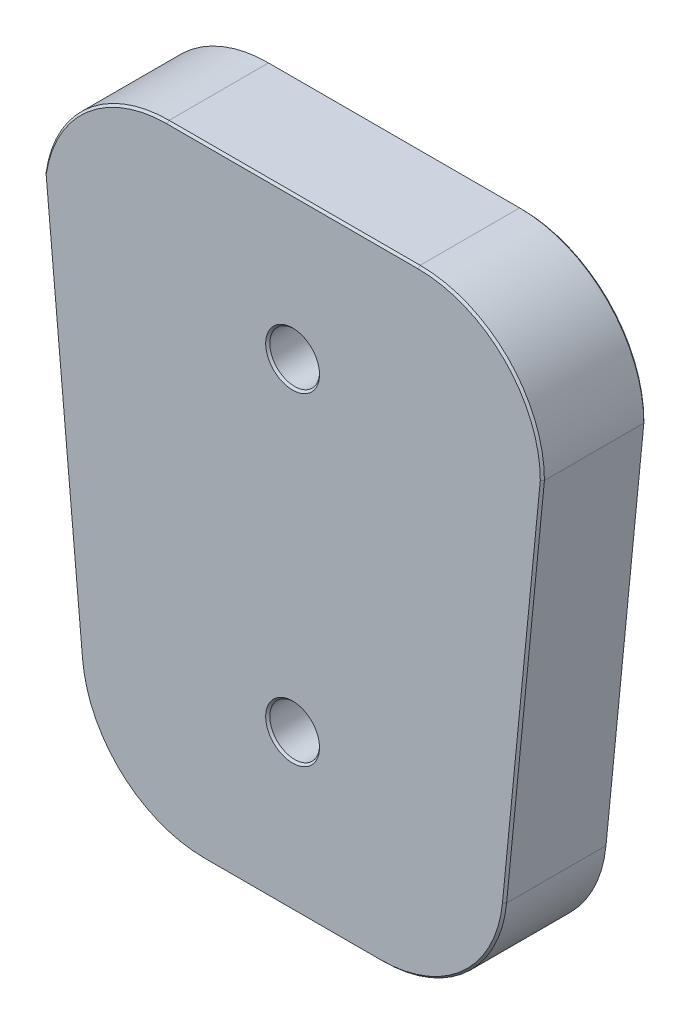
ISO-10303-21;
HEADER;
FILE_DESCRIPTION(('STEP AP214'),'2;1');
FILE_NAME('part.step','',(''),(''),'','','');
FILE_SCHEMA(('AUTOMOTIVE_DESIGN { 1 0 10303 214 1 1 1 1 }'));
ENDSEC;
DATA;
#1=APPLICATION_CONTEXT('core data for automotive mechanical design processes');
#2=APPLICATION_PROTOCOL_DEFINITION('international standard','automotive_design',2000,#1);
#3=PRODUCT_CONTEXT('',#1,'mechanical');
#4=PRODUCT('Part','Part','',(#3));
#5=PRODUCT_RELATED_PRODUCT_CATEGORY('part','',(#4));
#6=PRODUCT_DEFINITION_FORMATION('','',#4);
#7=PRODUCT_DEFINITION_CONTEXT('part definition',#1,'design');
#8=PRODUCT_DEFINITION('design','',#6,#7);
#9=PRODUCT_DEFINITION_SHAPE('','',#8);
#10=(LENGTH_UNIT() NAMED_UNIT(*) SI_UNIT(.MILLI.,.METRE.));
#11=(NAMED_UNIT(*) PLANE_ANGLE_UNIT() SI_UNIT($,.RADIAN.));
#12=(NAMED_UNIT(*) SI_UNIT($,.STERADIAN.) SOLID_ANGLE_UNIT());
#13=UNCERTAINTY_MEASURE_WITH_UNIT(LENGTH_MEASURE(1.E-05),#10,'distance_accuracy_value','');
#14=(GEOMETRIC_REPRESENTATION_CONTEXT(3) GLOBAL_UNCERTAINTY_ASSIGNED_CONTEXT((#13)) GLOBAL_UNIT_ASSIGNED_CONTEXT((#10,
#11,#12)) REPRESENTATION_CONTEXT('',''));
#15=CARTESIAN_POINT('',(0.,0.,0.));
#16=DIRECTION('',(0.,0.,1.));
#17=DIRECTION('',(1.,0.,0.));
#18=AXIS2_PLACEMENT_3D('',#15,#16,#17);
#19=CARTESIAN_POINT('',(0.,-25.6955708188177,25.));
#20=DIRECTION('',(0.995905243780852,0.0904032378280924,0.));
#21=DIRECTION('',(-0.0904032378280924,0.995905243780852,0.));
#22=AXIS2_PLACEMENT_3D('',#19,#20,#21);
#23=PLANE('',#22);
#24=DIRECTION('',(0.,0.,-1.));
#25=VECTOR('',#24,1.);
#26=CARTESIAN_POINT('',(0.,-25.6955708188177,25.));
#27=LINE('',#26,#25);
#28=CARTESIAN_POINT('',(0.,-25.6955708188177,24.5));
#29=VERTEX_POINT('',#28);
#30=CARTESIAN_POINT('',(0.,-25.6955708188177,0.5));
#31=VERTEX_POINT('',#30);
#32=EDGE_CURVE('E423',#29,#31,#27,.T.);
#33=ORIENTED_EDGE('',*,*,#32,.T.);
#34=DIRECTION('',(0.0904032378280924,-0.995905243780852,0.));
#35=VECTOR('',#34,1.);
#36=CARTESIAN_POINT('',(0.,-25.6955708188177,0.5));
#37=LINE('',#36,#35);
#38=CARTESIAN_POINT('',(8.80666926554806,-122.712097134843,0.5));
#39=VERTEX_POINT('',#38);
#40=EDGE_CURVE('E246',#31,#39,#37,.T.);
#41=ORIENTED_EDGE('',*,*,#40,.T.);
#42=DIRECTION('',(0.,0.,-1.));
#43=VECTOR('',#42,1.);
#44=CARTESIAN_POINT('',(8.80666926554806,-122.712097134843,25.));
#45=LINE('',#44,#43);
#46=CARTESIAN_POINT('',(8.80666926554806,-122.712097134843,24.5));
#47=VERTEX_POINT('',#46);
#48=EDGE_CURVE('E179',#47,#39,#45,.T.);
#49=ORIENTED_EDGE('',*,*,#48,.F.);
#50=DIRECTION('',(-0.0904032378280924,0.995905243780852,0.));
#51=VECTOR('',#50,1.);
#52=CARTESIAN_POINT('',(0.,-25.6955708188177,24.5));
#53=LINE('',#52,#51);
#54=EDGE_CURVE('E244',#47,#29,#53,.T.);
#55=ORIENTED_EDGE('',*,*,#54,.T.);
#56=EDGE_LOOP('',(#33,#41,#49,#55));
#57=FACE_BOUND('',#56,.T.);
#58=ADVANCED_FACE('F40',(#57),#23,.F.);
#59=CARTESIAN_POINT('',(38.6838265789736,-120.,25.));
#60=DIRECTION('',(0.,0.,-1.));
#61=DIRECTION('',(-1.,0.,0.));
#62=AXIS2_PLACEMENT_3D('',#59,#60,#61);
#63=CYLINDRICAL_SURFACE('',#62,30.);
#64=ORIENTED_EDGE('',*,*,#48,.T.);
#65=CARTESIAN_POINT('',(38.6838265789736,-120.,0.5));
#66=DIRECTION('',(0.,0.,1.));
#67=DIRECTION('',(1.,0.,0.));
#68=AXIS2_PLACEMENT_3D('',#65,#66,#67);
#69=CIRCLE('',#68,30.);
#70=CARTESIAN_POINT('',(38.6838265789738,-150.,0.5));
#71=VERTEX_POINT('',#70);
#72=EDGE_CURVE('E178',#39,#71,#69,.T.);
#73=ORIENTED_EDGE('',*,*,#72,.T.);
#74=DIRECTION('',(0.,0.,-1.));
#75=VECTOR('',#74,1.);
#76=CARTESIAN_POINT('',(38.6838265789738,-150.,25.));
#77=LINE('',#76,#75);
#78=CARTESIAN_POINT('',(38.6838265789738,-150.,24.5));
#79=VERTEX_POINT('',#78);
#80=EDGE_CURVE('E160',#79,#71,#77,.T.);
#81=ORIENTED_EDGE('',*,*,#80,.F.);
#82=CARTESIAN_POINT('',(38.6838265789736,-120.,24.5));
#83=DIRECTION('',(0.,0.,1.));
#84=DIRECTION('',(1.,0.,0.));
#85=AXIS2_PLACEMENT_3D('',#82,#83,#84);
#86=CIRCLE('',#85,30.);
#87=EDGE_CURVE('E175',#79,#47,#86,.F.);
#88=ORIENTED_EDGE('',*,*,#87,.T.);
#89=EDGE_LOOP('',(#64,#73,#81,#88));
#90=FACE_BOUND('',#89,.T.);
#91=ADVANCED_FACE('F173',(#90),#63,.T.);
#92=CARTESIAN_POINT('',(38.6838265789738,-150.,25.));
#93=DIRECTION('',(0.,1.,0.));
#94=DIRECTION('',(0.,0.,1.));
#95=AXIS2_PLACEMENT_3D('',#92,#93,#94);
#96=PLANE('',#95);
#97=ORIENTED_EDGE('',*,*,#80,.T.);
#98=DIRECTION('',(1.,0.,0.));
#99=VECTOR('',#98,1.);
#100=CARTESIAN_POINT('',(38.6838265789738,-150.,0.5));
#101=LINE('',#100,#99);
#102=CARTESIAN_POINT('',(81.3161734210264,-150.,0.5));
#103=VERTEX_POINT('',#102);
#104=EDGE_CURVE('E167',#71,#103,#101,.T.);
#105=ORIENTED_EDGE('',*,*,#104,.T.);
#106=DIRECTION('',(0.,0.,-1.));
#107=VECTOR('',#106,1.);
#108=CARTESIAN_POINT('',(81.3161734210264,-150.,25.));
#109=LINE('',#108,#107);
#110=CARTESIAN_POINT('',(81.3161734210264,-150.,24.5));
#111=VERTEX_POINT('',#110);
#112=EDGE_CURVE('E162',#111,#103,#109,.T.);
#113=ORIENTED_EDGE('',*,*,#112,.F.);
#114=DIRECTION('',(-1.,0.,0.));
#115=VECTOR('',#114,1.);
#116=CARTESIAN_POINT('',(38.6838265789738,-150.,24.5));
#117=LINE('',#116,#115);
#118=EDGE_CURVE('E157',#111,#79,#117,.T.);
#119=ORIENTED_EDGE('',*,*,#118,.T.);
#120=EDGE_LOOP('',(#97,#105,#113,#119));
#121=FACE_BOUND('',#120,.T.);
#122=ADVANCED_FACE('F159',(#121),#96,.F.);
#123=CARTESIAN_POINT('',(81.3161734210264,-120.,25.));
#124=DIRECTION('',(0.,0.,-1.));
#125=DIRECTION('',(-1.,0.,0.));
#126=AXIS2_PLACEMENT_3D('',#123,#124,#125);
#127=CYLINDRICAL_SURFACE('',#126,30.);
#128=ORIENTED_EDGE('',*,*,#112,.T.);
#129=CARTESIAN_POINT('',(81.3161734210264,-120.,0.5));
#130=DIRECTION('',(0.,0.,1.));
#131=DIRECTION('',(1.,0.,0.));
#132=AXIS2_PLACEMENT_3D('',#129,#130,#131);
#133=CIRCLE('',#132,30.);
#134=CARTESIAN_POINT('',(111.172189546731,-122.935694313387,0.5));
#135=VERTEX_POINT('',#134);
#136=EDGE_CURVE('E225',#103,#135,#133,.T.);
#137=ORIENTED_EDGE('',*,*,#136,.T.);
#138=DIRECTION('',(0.,0.,-1.));
#139=VECTOR('',#138,1.);
#140=CARTESIAN_POINT('',(111.172189546731,-122.935694313387,25.));
#141=LINE('',#140,#139);
#142=CARTESIAN_POINT('',(111.172189546731,-122.935694313387,24.5));
#143=VERTEX_POINT('',#142);
#144=EDGE_CURVE('E408',#143,#135,#141,.T.);
#145=ORIENTED_EDGE('',*,*,#144,.F.);
#146=CARTESIAN_POINT('',(81.3161734210264,-120.,24.5));
#147=DIRECTION('',(0.,0.,1.));
#148=DIRECTION('',(1.,0.,0.));
#149=AXIS2_PLACEMENT_3D('',#146,#147,#148);
#150=CIRCLE('',#149,30.);
#151=EDGE_CURVE('E223',#143,#111,#150,.F.);
#152=ORIENTED_EDGE('',*,*,#151,.T.);
#153=EDGE_LOOP('',(#128,#137,#145,#152));
#154=FACE_BOUND('',#153,.T.);
#155=ADVANCED_FACE('F405',(#154),#127,.T.);
#156=CARTESIAN_POINT('',(111.172189546731,-122.935694313387,25.));
#157=DIRECTION('',(-0.995200537523495,0.0978564771128945,0.));
#158=DIRECTION('',(-0.0978564771128945,-0.995200537523495,0.));
#159=AXIS2_PLACEMENT_3D('',#156,#157,#158);
#160=PLANE('',#159);
#161=ORIENTED_EDGE('',*,*,#144,.T.);
#162=DIRECTION('',(0.0978564771128945,0.995200537523495,0.));
#163=VECTOR('',#162,1.);
#164=CARTESIAN_POINT('',(111.172189546731,-122.935694313387,0.5));
#165=LINE('',#164,#163);
#166=CARTESIAN_POINT('',(120.310407725531,-30.0000000000002,0.5));
#167=VERTEX_POINT('',#166);
#168=EDGE_CURVE('E229',#135,#167,#165,.T.);
#169=ORIENTED_EDGE('',*,*,#168,.T.);
#170=DIRECTION('',(0.,0.,-1.));
#171=VECTOR('',#170,1.);
#172=CARTESIAN_POINT('',(120.310407725531,-30.0000000000002,25.));
#173=LINE('',#172,#171);
#174=CARTESIAN_POINT('',(120.310407725531,-30.0000000000002,24.5));
#175=VERTEX_POINT('',#174);
#176=EDGE_CURVE('E411',#175,#167,#173,.T.);
#177=ORIENTED_EDGE('',*,*,#176,.F.);
#178=DIRECTION('',(-0.0978564771128945,-0.995200537523495,0.));
#179=VECTOR('',#178,1.);
#180=CARTESIAN_POINT('',(111.172189546731,-122.935694313387,24.5));
#181=LINE('',#180,#179);
#182=EDGE_CURVE('E227',#175,#143,#181,.T.);
#183=ORIENTED_EDGE('',*,*,#182,.T.);
#184=EDGE_LOOP('',(#161,#169,#177,#183));
#185=FACE_BOUND('',#184,.T.);
#186=ADVANCED_FACE('F571',(#185),#160,.F.);
#187=CARTESIAN_POINT('',(90.3104077255314,-30.,25.));
#188=DIRECTION('',(0.,0.,-1.));
#189=DIRECTION('',(-1.,0.,0.));
#190=AXIS2_PLACEMENT_3D('',#187,#188,#189);
#191=CYLINDRICAL_SURFACE('',#190,30.);
#192=ORIENTED_EDGE('',*,*,#176,.T.);
#193=CARTESIAN_POINT('',(90.3104077255314,-30.,0.5));
#194=DIRECTION('',(0.,0.,1.));
#195=DIRECTION('',(1.,0.,0.));
#196=AXIS2_PLACEMENT_3D('',#193,#194,#195);
#197=CIRCLE('',#196,30.);
#198=CARTESIAN_POINT('',(90.3104077255314,0.,0.5));
#199=VERTEX_POINT('',#198);
#200=EDGE_CURVE('E233',#167,#199,#197,.T.);
#201=ORIENTED_EDGE('',*,*,#200,.T.);
#202=DIRECTION('',(0.,0.,-1.));
#203=VECTOR('',#202,1.);
#204=CARTESIAN_POINT('',(90.3104077255314,0.,25.));
#205=LINE('',#204,#203);
#206=CARTESIAN_POINT('',(90.3104077255314,0.,24.5));
#207=VERTEX_POINT('',#206);
#208=EDGE_CURVE('E415',#207,#199,#205,.T.);
#209=ORIENTED_EDGE('',*,*,#208,.F.);
#210=CARTESIAN_POINT('',(90.3104077255314,-30.,24.5));
#211=DIRECTION('',(0.,0.,1.));
#212=DIRECTION('',(1.,0.,0.));
#213=AXIS2_PLACEMENT_3D('',#210,#211,#212);
#214=CIRCLE('',#213,30.);
#215=EDGE_CURVE('E231',#207,#175,#214,.F.);
#216=ORIENTED_EDGE('',*,*,#215,.T.);
#217=EDGE_LOOP('',(#192,#201,#209,#216));
#218=FACE_BOUND('',#217,.T.);
#219=ADVANCED_FACE('F569',(#218),#191,.T.);
#220=CARTESIAN_POINT('',(29.6895922744686,0.,25.));
#221=DIRECTION('',(0.,1.,0.));
#222=DIRECTION('',(-1.,0.,0.));
#223=AXIS2_PLACEMENT_3D('',#220,#221,#222);
#224=PLANE('',#223);
#225=ORIENTED_EDGE('',*,*,#208,.T.);
#226=DIRECTION('',(-1.,0.,0.));
#227=VECTOR('',#226,1.);
#228=CARTESIAN_POINT('',(29.6895922744686,0.,0.5));
#229=LINE('',#228,#227);
#230=CARTESIAN_POINT('',(29.6895922744686,0.,0.5));
#231=VERTEX_POINT('',#230);
#232=EDGE_CURVE('E237',#199,#231,#229,.T.);
#233=ORIENTED_EDGE('',*,*,#232,.T.);
#234=DIRECTION('',(0.,0.,-1.));
#235=VECTOR('',#234,1.);
#236=CARTESIAN_POINT('',(29.6895922744686,0.,25.));
#237=LINE('',#236,#235);
#238=CARTESIAN_POINT('',(29.6895922744686,0.,24.5));
#239=VERTEX_POINT('',#238);
#240=EDGE_CURVE('E420',#239,#231,#237,.T.);
#241=ORIENTED_EDGE('',*,*,#240,.F.);
#242=DIRECTION('',(1.,0.,0.));
#243=VECTOR('',#242,1.);
#244=CARTESIAN_POINT('',(29.6895922744686,0.,24.5));
#245=LINE('',#244,#243);
#246=EDGE_CURVE('E235',#239,#207,#245,.T.);
#247=ORIENTED_EDGE('',*,*,#246,.T.);
#248=EDGE_LOOP('',(#225,#233,#241,#247));
#249=FACE_BOUND('',#248,.T.);
#250=ADVANCED_FACE('F567',(#249),#224,.T.);
#251=CARTESIAN_POINT('',(29.6895922744686,-30.,25.));
#252=DIRECTION('',(0.,0.,-1.));
#253=DIRECTION('',(-1.,0.,0.));
#254=AXIS2_PLACEMENT_3D('',#251,#252,#253);
#255=CYLINDRICAL_SURFACE('',#254,30.);
#256=ORIENTED_EDGE('',*,*,#240,.T.);
#257=CARTESIAN_POINT('',(29.6895922744686,-30.,0.5));
#258=DIRECTION('',(0.,0.,1.));
#259=DIRECTION('',(1.,0.,0.));
#260=AXIS2_PLACEMENT_3D('',#257,#258,#259);
#261=CIRCLE('',#260,30.);
#262=EDGE_CURVE('E242',#231,#31,#261,.T.);
#263=ORIENTED_EDGE('',*,*,#262,.T.);
#264=ORIENTED_EDGE('',*,*,#32,.F.);
#265=CARTESIAN_POINT('',(29.6895922744686,-30.,24.5));
#266=DIRECTION('',(0.,0.,1.));
#267=DIRECTION('',(1.,0.,0.));
#268=AXIS2_PLACEMENT_3D('',#265,#266,#267);
#269=CIRCLE('',#268,30.);
#270=EDGE_CURVE('E239',#29,#239,#269,.F.);
#271=ORIENTED_EDGE('',*,*,#270,.T.);
#272=EDGE_LOOP('',(#256,#263,#264,#271));
#273=FACE_BOUND('',#272,.T.);
#274=ADVANCED_FACE('F518',(#273),#255,.T.);
#275=CARTESIAN_POINT('',(38.6838265789736,-120.,25.));
#276=DIRECTION('',(0.,0.,1.));
#277=DIRECTION('',(1.,0.,0.));
#278=AXIS2_PLACEMENT_3D('',#275,#276,#277);
#279=PLANE('',#278);
#280=DIRECTION('',(-1.,0.,0.));
#281=VECTOR('',#280,1.);
#282=CARTESIAN_POINT('',(38.6838265789736,-0.5,25.));
#283=LINE('',#282,#281);
#284=CARTESIAN_POINT('',(90.3104077255314,-0.499999999999994,25.));
#285=VERTEX_POINT('',#284);
#286=CARTESIAN_POINT('',(29.6895922744686,-0.500000000000002,25.));
#287=VERTEX_POINT('',#286);
#288=EDGE_CURVE('E58',#285,#287,#283,.T.);
#289=ORIENTED_EDGE('',*,*,#288,.T.);
#290=CARTESIAN_POINT('',(29.6895922744686,-30.,25.));
#291=DIRECTION('',(0.,0.,1.));
#292=DIRECTION('',(1.,0.,0.));
#293=AXIS2_PLACEMENT_3D('',#290,#291,#292);
#294=CIRCLE('',#293,29.5);
#295=CARTESIAN_POINT('',(0.50329972612178,-25.7092742709054,25.));
#296=VERTEX_POINT('',#295);
#297=EDGE_CURVE('E271',#287,#296,#294,.T.);
#298=ORIENTED_EDGE('',*,*,#297,.T.);
#299=DIRECTION('',(0.0904032378280924,-0.995905243780852,0.));
#300=VECTOR('',#299,1.);
#301=CARTESIAN_POINT('',(9.30462188743848,-122.666895515929,25.));
#302=LINE('',#301,#300);
#303=CARTESIAN_POINT('',(9.30462188743849,-122.666895515929,25.));
#304=VERTEX_POINT('',#303);
#305=EDGE_CURVE('E260',#296,#304,#302,.T.);
#306=ORIENTED_EDGE('',*,*,#305,.T.);
#307=CARTESIAN_POINT('',(38.6838265789736,-120.,25.));
#308=DIRECTION('',(0.,0.,1.));
#309=DIRECTION('',(1.,0.,0.));
#310=AXIS2_PLACEMENT_3D('',#307,#308,#309);
#311=CIRCLE('',#310,29.5);
#312=CARTESIAN_POINT('',(38.6838265789738,-149.5,25.));
#313=VERTEX_POINT('',#312);
#314=EDGE_CURVE('E262',#304,#313,#311,.T.);
#315=ORIENTED_EDGE('',*,*,#314,.T.);
#316=DIRECTION('',(1.,0.,0.));
#317=VECTOR('',#316,1.);
#318=CARTESIAN_POINT('',(81.3161734210264,-149.5,25.));
#319=LINE('',#318,#317);
#320=CARTESIAN_POINT('',(81.3161734210264,-149.5,25.));
#321=VERTEX_POINT('',#320);
#322=EDGE_CURVE('E185',#313,#321,#319,.T.);
#323=ORIENTED_EDGE('',*,*,#322,.T.);
#324=CARTESIAN_POINT('',(81.3161734210264,-120.,25.));
#325=DIRECTION('',(0.,0.,1.));
#326=DIRECTION('',(1.,0.,0.));
#327=AXIS2_PLACEMENT_3D('',#324,#325,#326);
#328=CIRCLE('',#327,29.5);
#329=CARTESIAN_POINT('',(110.67458927797,-122.88676607483,25.));
#330=VERTEX_POINT('',#329);
#331=EDGE_CURVE('E265',#321,#330,#328,.T.);
#332=ORIENTED_EDGE('',*,*,#331,.T.);
#333=DIRECTION('',(0.0978564771128945,0.995200537523495,0.));
#334=VECTOR('',#333,1.);
#335=CARTESIAN_POINT('',(119.81280745677,-29.9510717614438,25.));
#336=LINE('',#335,#334);
#337=CARTESIAN_POINT('',(119.810397617989,-29.9755798259138,25.));
#338=VERTEX_POINT('',#337);
#339=EDGE_CURVE('E267',#330,#338,#336,.T.);
#340=ORIENTED_EDGE('',*,*,#339,.T.);
#341=CARTESIAN_POINT('',(90.3104077255314,-30.,25.));
#342=DIRECTION('',(0.,0.,1.));
#343=DIRECTION('',(1.,0.,0.));
#344=AXIS2_PLACEMENT_3D('',#341,#342,#343);
#345=CIRCLE('',#344,29.5);
#346=EDGE_CURVE('E63',#338,#285,#345,.T.);
#347=ORIENTED_EDGE('',*,*,#346,.T.);
#348=EDGE_LOOP('',(#289,#298,#306,#315,#323,#332,#340,#347));
#349=FACE_BOUND('',#348,.T.);
#350=CARTESIAN_POINT('',(60.0000000000001,-112.5,25.));
#351=DIRECTION('',(0.,0.,1.));
#352=DIRECTION('',(1.,0.,0.));
#353=AXIS2_PLACEMENT_3D('',#350,#351,#352);
#354=CIRCLE('',#353,6.50000000000001);
#355=CARTESIAN_POINT('',(66.5000000000001,-112.5,25.));
#356=VERTEX_POINT('',#355);
#357=EDGE_CURVE('E257',#356,#356,#354,.F.);
#358=ORIENTED_EDGE('',*,*,#357,.T.);
#359=EDGE_LOOP('',(#358));
#360=FACE_BOUND('',#359,.T.);
#361=CARTESIAN_POINT('',(60.,-34.5,25.));
#362=DIRECTION('',(0.,0.,1.));
#363=DIRECTION('',(1.,0.,0.));
#364=AXIS2_PLACEMENT_3D('',#361,#362,#363);
#365=CIRCLE('',#364,6.5);
#366=CARTESIAN_POINT('',(66.5,-34.5,25.));
#367=VERTEX_POINT('',#366);
#368=EDGE_CURVE('E254',#367,#367,#365,.F.);
#369=ORIENTED_EDGE('',*,*,#368,.T.);
#370=EDGE_LOOP('',(#369));
#371=FACE_BOUND('',#370,.T.);
#372=ADVANCED_FACE('F525',(#349,#360,#371),#279,.T.);
#373=CARTESIAN_POINT('',(38.6838265789736,-120.,0.));
#374=DIRECTION('',(0.,0.,1.));
#375=DIRECTION('',(1.,0.,0.));
#376=AXIS2_PLACEMENT_3D('',#373,#374,#375);
#377=PLANE('',#376);
#378=DIRECTION('',(-1.,0.,0.));
#379=VECTOR('',#378,1.);
#380=CARTESIAN_POINT('',(38.6838265789736,-149.5,0.));
#381=LINE('',#380,#379);
#382=CARTESIAN_POINT('',(81.3161734210264,-149.5,0.));
#383=VERTEX_POINT('',#382);
#384=CARTESIAN_POINT('',(38.6838265789738,-149.5,0.));
#385=VERTEX_POINT('',#384);
#386=EDGE_CURVE('E218',#383,#385,#381,.T.);
#387=ORIENTED_EDGE('',*,*,#386,.T.);
#388=CARTESIAN_POINT('',(38.6838265789736,-120.,0.));
#389=DIRECTION('',(0.,0.,1.));
#390=DIRECTION('',(1.,0.,0.));
#391=AXIS2_PLACEMENT_3D('',#388,#389,#390);
#392=CIRCLE('',#391,29.5);
#393=CARTESIAN_POINT('',(9.30462188743849,-122.666895515929,0.));
#394=VERTEX_POINT('',#393);
#395=EDGE_CURVE('E168',#385,#394,#392,.F.);
#396=ORIENTED_EDGE('',*,*,#395,.T.);
#397=DIRECTION('',(-0.0904032378280924,0.995905243780852,0.));
#398=VECTOR('',#397,1.);
#399=CARTESIAN_POINT('',(9.30462188743851,-122.666895515929,0.));
#400=LINE('',#399,#398);
#401=CARTESIAN_POINT('',(0.50329972612178,-25.7092742709054,0.));
#402=VERTEX_POINT('',#401);
#403=EDGE_CURVE('E206',#394,#402,#400,.T.);
#404=ORIENTED_EDGE('',*,*,#403,.T.);
#405=CARTESIAN_POINT('',(29.6895922744686,-30.,0.));
#406=DIRECTION('',(0.,0.,1.));
#407=DIRECTION('',(1.,0.,0.));
#408=AXIS2_PLACEMENT_3D('',#405,#406,#407);
#409=CIRCLE('',#408,29.5);
#410=CARTESIAN_POINT('',(29.6895922744686,-0.499999999999998,0.));
#411=VERTEX_POINT('',#410);
#412=EDGE_CURVE('E208',#402,#411,#409,.F.);
#413=ORIENTED_EDGE('',*,*,#412,.T.);
#414=DIRECTION('',(1.,0.,0.));
#415=VECTOR('',#414,1.);
#416=CARTESIAN_POINT('',(90.3104077255314,-0.499999999999994,0.));
#417=LINE('',#416,#415);
#418=CARTESIAN_POINT('',(90.3104077255314,-0.499999999999994,0.));
#419=VERTEX_POINT('',#418);
#420=EDGE_CURVE('E210',#411,#419,#417,.T.);
#421=ORIENTED_EDGE('',*,*,#420,.T.);
#422=CARTESIAN_POINT('',(90.3104077255314,-30.,0.));
#423=DIRECTION('',(0.,0.,1.));
#424=DIRECTION('',(1.,0.,0.));
#425=AXIS2_PLACEMENT_3D('',#422,#423,#424);
#426=CIRCLE('',#425,29.5);
#427=CARTESIAN_POINT('',(119.810397617989,-29.9755798259138,0.));
#428=VERTEX_POINT('',#427);
#429=EDGE_CURVE('E212',#419,#428,#426,.F.);
#430=ORIENTED_EDGE('',*,*,#429,.T.);
#431=DIRECTION('',(-0.0978564771128945,-0.995200537523495,0.));
#432=VECTOR('',#431,1.);
#433=CARTESIAN_POINT('',(110.266346609353,-127.038594704206,0.));
#434=LINE('',#433,#432);
#435=CARTESIAN_POINT('',(110.67458927797,-122.88676607483,0.));
#436=VERTEX_POINT('',#435);
#437=EDGE_CURVE('E214',#428,#436,#434,.T.);
#438=ORIENTED_EDGE('',*,*,#437,.T.);
#439=CARTESIAN_POINT('',(81.3161734210264,-120.,0.));
#440=DIRECTION('',(0.,0.,1.));
#441=DIRECTION('',(1.,0.,0.));
#442=AXIS2_PLACEMENT_3D('',#439,#440,#441);
#443=CIRCLE('',#442,29.5);
#444=EDGE_CURVE('E216',#436,#383,#443,.F.);
#445=ORIENTED_EDGE('',*,*,#444,.T.);
#446=EDGE_LOOP('',(#387,#396,#404,#413,#421,#430,#438,#445));
#447=FACE_BOUND('',#446,.T.);
#448=CARTESIAN_POINT('',(60.0000000000001,-112.5,0.));
#449=DIRECTION('',(0.,0.,1.));
#450=DIRECTION('',(1.,0.,0.));
#451=AXIS2_PLACEMENT_3D('',#448,#449,#450);
#452=CIRCLE('',#451,3.69999999999998);
#453=CARTESIAN_POINT('',(63.7000000000001,-112.5,0.));
#454=VERTEX_POINT('',#453);
#455=EDGE_CURVE('E203',#454,#454,#452,.T.);
#456=ORIENTED_EDGE('',*,*,#455,.T.);
#457=EDGE_LOOP('',(#456));
#458=FACE_BOUND('',#457,.T.);
#459=CARTESIAN_POINT('',(60.,-34.5,0.));
#460=DIRECTION('',(0.,0.,1.));
#461=DIRECTION('',(1.,0.,0.));
#462=AXIS2_PLACEMENT_3D('',#459,#460,#461);
#463=CIRCLE('',#462,3.69999999999997);
#464=CARTESIAN_POINT('',(63.7,-34.5,0.));
#465=VERTEX_POINT('',#464);
#466=EDGE_CURVE('E197',#465,#465,#463,.T.);
#467=ORIENTED_EDGE('',*,*,#466,.T.);
#468=EDGE_LOOP('',(#467));
#469=FACE_BOUND('',#468,.T.);
#470=ADVANCED_FACE('F507',(#447,#458,#469),#377,.F.);
#471=CARTESIAN_POINT('',(60.0000000000001,-112.5,13.));
#472=DIRECTION('',(0.,0.,1.));
#473=DIRECTION('',(1.,0.,0.));
#474=AXIS2_PLACEMENT_3D('',#471,#472,#473);
#475=CYLINDRICAL_SURFACE('',#474,6.);
#476=CARTESIAN_POINT('',(60.0000000000001,-112.5,24.5));
#477=DIRECTION('',(0.,0.,1.));
#478=DIRECTION('',(1.,0.,0.));
#479=AXIS2_PLACEMENT_3D('',#476,#477,#478);
#480=CIRCLE('',#479,6.);
#481=CARTESIAN_POINT('',(66.0000000000001,-112.5,24.5));
#482=VERTEX_POINT('',#481);
#483=EDGE_CURVE('E50',#482,#482,#480,.T.);
#484=ORIENTED_EDGE('',*,*,#483,.T.);
#485=EDGE_LOOP('',(#484));
#486=FACE_BOUND('',#485,.T.);
#487=CARTESIAN_POINT('',(60.0000000000001,-112.5,13.));
#488=DIRECTION('',(0.,0.,1.));
#489=DIRECTION('',(1.,0.,0.));
#490=AXIS2_PLACEMENT_3D('',#487,#488,#489);
#491=CIRCLE('',#490,6.);
#492=CARTESIAN_POINT('',(66.0000000000001,-112.5,13.));
#493=VERTEX_POINT('',#492);
#494=EDGE_CURVE('E427',#493,#493,#491,.T.);
#495=ORIENTED_EDGE('',*,*,#494,.F.);
#496=EDGE_LOOP('',(#495));
#497=FACE_BOUND('',#496,.T.);
#498=ADVANCED_FACE('F456',(#486,#497),#475,.F.);
#499=CARTESIAN_POINT('',(60.0000000000001,-112.5,13.));
#500=DIRECTION('',(0.,0.,1.));
#501=DIRECTION('',(1.,0.,0.));
#502=AXIS2_PLACEMENT_3D('',#499,#500,#501);
#503=PLANE('',#502);
#504=CARTESIAN_POINT('',(60.0000000000001,-112.5,13.));
#505=DIRECTION('',(0.,0.,1.));
#506=DIRECTION('',(1.,0.,0.));
#507=AXIS2_PLACEMENT_3D('',#504,#505,#506);
#508=CIRCLE('',#507,3.19999999999999);
#509=CARTESIAN_POINT('',(63.2000000000001,-112.5,13.));
#510=VERTEX_POINT('',#509);
#511=EDGE_CURVE('E338',#510,#510,#508,.T.);
#512=ORIENTED_EDGE('',*,*,#511,.F.);
#513=EDGE_LOOP('',(#512));
#514=FACE_BOUND('',#513,.T.);
#515=ORIENTED_EDGE('',*,*,#494,.T.);
#516=EDGE_LOOP('',(#515));
#517=FACE_BOUND('',#516,.T.);
#518=ADVANCED_FACE('F448',(#514,#517),#503,.T.);
#519=CARTESIAN_POINT('',(60.,-34.5,13.));
#520=DIRECTION('',(0.,0.,1.));
#521=DIRECTION('',(1.,0.,0.));
#522=AXIS2_PLACEMENT_3D('',#519,#520,#521);
#523=CYLINDRICAL_SURFACE('',#522,5.99999999999999);
#524=CARTESIAN_POINT('',(60.,-34.5,24.5));
#525=DIRECTION('',(0.,0.,1.));
#526=DIRECTION('',(1.,0.,0.));
#527=AXIS2_PLACEMENT_3D('',#524,#525,#526);
#528=CIRCLE('',#527,5.99999999999999);
#529=CARTESIAN_POINT('',(66.,-34.5,24.5));
#530=VERTEX_POINT('',#529);
#531=EDGE_CURVE('E11',#530,#530,#528,.T.);
#532=ORIENTED_EDGE('',*,*,#531,.T.);
#533=EDGE_LOOP('',(#532));
#534=FACE_BOUND('',#533,.T.);
#535=CARTESIAN_POINT('',(60.,-34.5,13.));
#536=DIRECTION('',(0.,0.,1.));
#537=DIRECTION('',(1.,0.,0.));
#538=AXIS2_PLACEMENT_3D('',#535,#536,#537);
#539=CIRCLE('',#538,5.99999999999999);
#540=CARTESIAN_POINT('',(66.,-34.5,13.));
#541=VERTEX_POINT('',#540);
#542=EDGE_CURVE('E426',#541,#541,#539,.T.);
#543=ORIENTED_EDGE('',*,*,#542,.F.);
#544=EDGE_LOOP('',(#543));
#545=FACE_BOUND('',#544,.T.);
#546=ADVANCED_FACE('F443',(#534,#545),#523,.F.);
#547=CARTESIAN_POINT('',(60.,-34.5,13.));
#548=DIRECTION('',(0.,0.,1.));
#549=DIRECTION('',(1.,0.,0.));
#550=AXIS2_PLACEMENT_3D('',#547,#548,#549);
#551=PLANE('',#550);
#552=CARTESIAN_POINT('',(60.,-34.5,13.));
#553=DIRECTION('',(0.,0.,1.));
#554=DIRECTION('',(1.,0.,0.));
#555=AXIS2_PLACEMENT_3D('',#552,#553,#554);
#556=CIRCLE('',#555,3.2);
#557=CARTESIAN_POINT('',(63.2,-34.5,13.));
#558=VERTEX_POINT('',#557);
#559=EDGE_CURVE('E430',#558,#558,#556,.T.);
#560=ORIENTED_EDGE('',*,*,#559,.F.);
#561=EDGE_LOOP('',(#560));
#562=FACE_BOUND('',#561,.T.);
#563=ORIENTED_EDGE('',*,*,#542,.T.);
#564=EDGE_LOOP('',(#563));
#565=FACE_BOUND('',#564,.T.);
#566=ADVANCED_FACE('F439',(#562,#565),#551,.T.);
#567=CARTESIAN_POINT('',(60.0000000000001,-112.5,0.));
#568=DIRECTION('',(0.,0.,1.));
#569=DIRECTION('',(1.,0.,0.));
#570=AXIS2_PLACEMENT_3D('',#567,#568,#569);
#571=CYLINDRICAL_SURFACE('',#570,3.19999999999999);
#572=CARTESIAN_POINT('',(60.0000000000001,-112.5,0.49999999999997));
#573=DIRECTION('',(0.,0.,1.));
#574=DIRECTION('',(1.,0.,0.));
#575=AXIS2_PLACEMENT_3D('',#572,#573,#574);
#576=CIRCLE('',#575,3.19999999999999);
#577=CARTESIAN_POINT('',(63.2000000000001,-112.5,0.49999999999997));
#578=VERTEX_POINT('',#577);
#579=EDGE_CURVE('E248',#578,#578,#576,.F.);
#580=ORIENTED_EDGE('',*,*,#579,.T.);
#581=EDGE_LOOP('',(#580));
#582=FACE_BOUND('',#581,.T.);
#583=ORIENTED_EDGE('',*,*,#511,.T.);
#584=EDGE_LOOP('',(#583));
#585=FACE_BOUND('',#584,.T.);
#586=ADVANCED_FACE('F442',(#582,#585),#571,.F.);
#587=CARTESIAN_POINT('',(60.,-34.5,0.));
#588=DIRECTION('',(0.,0.,1.));
#589=DIRECTION('',(1.,0.,0.));
#590=AXIS2_PLACEMENT_3D('',#587,#588,#589);
#591=CYLINDRICAL_SURFACE('',#590,3.2);
#592=CARTESIAN_POINT('',(60.,-34.5,0.499999999999961));
#593=DIRECTION('',(0.,0.,1.));
#594=DIRECTION('',(1.,0.,0.));
#595=AXIS2_PLACEMENT_3D('',#592,#593,#594);
#596=CIRCLE('',#595,3.2);
#597=CARTESIAN_POINT('',(63.2,-34.5,0.499999999999961));
#598=VERTEX_POINT('',#597);
#599=EDGE_CURVE('E251',#598,#598,#596,.F.);
#600=ORIENTED_EDGE('',*,*,#599,.T.);
#601=EDGE_LOOP('',(#600));
#602=FACE_BOUND('',#601,.T.);
#603=ORIENTED_EDGE('',*,*,#559,.T.);
#604=EDGE_LOOP('',(#603));
#605=FACE_BOUND('',#604,.T.);
#606=ADVANCED_FACE('F322',(#602,#605),#591,.F.);
#607=CARTESIAN_POINT('',(90.3104077255314,-30.,0.));
#608=DIRECTION('',(0.,0.,1.));
#609=DIRECTION('',(1.,0.,0.));
#610=AXIS2_PLACEMENT_3D('',#607,#608,#609);
#611=CONICAL_SURFACE('',#610,29.5,0.785398163397445);
#612=CARTESIAN_POINT('',(120.310407725531,-30.0000000000002,0.5));
#613=CARTESIAN_POINT('',(120.22707397408,-29.9959127457714,0.416666241461771));
#614=CARTESIAN_POINT('',(120.143739589394,-29.9918341041499,0.333332695527868));
#615=CARTESIAN_POINT('',(119.977069553547,-29.9836940461211,0.1666660288612));
#616=CARTESIAN_POINT('',(119.893733902385,-29.9796326297139,0.0833329081284344));
#617=CARTESIAN_POINT('',(119.810397617989,-29.9755798259139,0.));
#618=B_SPLINE_CURVE_WITH_KNOTS('',3,(#612,#613,#614,#615,#616,#617),.UNSPECIFIED.,.F.,.F.,(4,2,
4),(0.,0.353767739904412,0.707535479840739),.UNSPECIFIED.);
#619=EDGE_CURVE('E327',#428,#167,#618,.F.);
#620=ORIENTED_EDGE('',*,*,#619,.F.);
#621=ORIENTED_EDGE('',*,*,#429,.F.);
#622=DIRECTION('',(0.,-0.707106781186548,-0.707106781186547));
#623=VECTOR('',#622,1.);
#624=CARTESIAN_POINT('',(90.3104077255314,0.,0.5));
#625=LINE('',#624,#623);
#626=EDGE_CURVE('E334',#199,#419,#625,.T.);
#627=ORIENTED_EDGE('',*,*,#626,.F.);
#628=ORIENTED_EDGE('',*,*,#200,.F.);
#629=EDGE_LOOP('',(#620,#621,#627,#628));
#630=FACE_BOUND('',#629,.T.);
#631=ADVANCED_FACE('F314',(#630),#611,.T.);
#632=CARTESIAN_POINT('',(38.6838265789736,-0.5,0.));
#633=DIRECTION('',(0.,0.707106781186547,-0.707106781186548));
#634=DIRECTION('',(-1.,0.,0.));
#635=AXIS2_PLACEMENT_3D('',#632,#633,#634);
#636=PLANE('',#635);
#637=ORIENTED_EDGE('',*,*,#626,.T.);
#638=ORIENTED_EDGE('',*,*,#420,.F.);
#639=DIRECTION('',(0.,-0.707106781186548,-0.707106781186547));
#640=VECTOR('',#639,1.);
#641=CARTESIAN_POINT('',(29.6895922744686,0.,0.5));
#642=LINE('',#641,#640);
#643=EDGE_CURVE('E335',#231,#411,#642,.T.);
#644=ORIENTED_EDGE('',*,*,#643,.F.);
#645=ORIENTED_EDGE('',*,*,#232,.F.);
#646=EDGE_LOOP('',(#637,#638,#644,#645));
#647=FACE_BOUND('',#646,.T.);
#648=ADVANCED_FACE('F321',(#647),#636,.T.);
#649=CARTESIAN_POINT('',(111.172189546731,-122.935694313387,0.5));
#650=DIRECTION('',(-0.703713048723362,0.069194978549554,0.707106781186546));
#651=DIRECTION('',(0.0978564771128945,0.995200537523495,0.));
#652=AXIS2_PLACEMENT_3D('',#649,#650,#651);
#653=PLANE('',#652);
#654=ORIENTED_EDGE('',*,*,#619,.T.);
#655=ORIENTED_EDGE('',*,*,#168,.F.);
#656=DIRECTION('',(0.703713048723361,-0.0691949785495464,0.707106781186547));
#657=VECTOR('',#656,1.);
#658=CARTESIAN_POINT('',(110.67458927797,-122.88676607483,0.));
#659=LINE('',#658,#657);
#660=EDGE_CURVE('E291',#436,#135,#659,.T.);
#661=ORIENTED_EDGE('',*,*,#660,.F.);
#662=ORIENTED_EDGE('',*,*,#437,.F.);
#663=EDGE_LOOP('',(#654,#655,#661,#662));
#664=FACE_BOUND('',#663,.T.);
#665=ADVANCED_FACE('F306',(#664),#653,.F.);
#666=CARTESIAN_POINT('',(29.6895922744686,-30.,0.5));
#667=DIRECTION('',(0.,0.,1.));
#668=DIRECTION('',(1.,0.,0.));
#669=AXIS2_PLACEMENT_3D('',#666,#667,#668);
#670=CONICAL_SURFACE('',#669,30.,0.785398163397445);
#671=ORIENTED_EDGE('',*,*,#643,.T.);
#672=ORIENTED_EDGE('',*,*,#412,.F.);
#673=CARTESIAN_POINT('',(0.,-25.6955708188177,0.5));
#674=CARTESIAN_POINT('',(0.0838819739334948,-25.6978129670793,0.416664199763483));
#675=CARTESIAN_POINT('',(0.167764604732686,-25.7000759955504,0.333329632989521));
#676=CARTESIAN_POINT('',(0.33553118010661,-25.7046438129129,0.166662966322853));
#677=CARTESIAN_POINT('',(0.419415124681345,-25.7069486018044,0.0833308664301478));
#678=CARTESIAN_POINT('',(0.50329972612178,-25.7092742709054,0.));
#679=B_SPLINE_CURVE_WITH_KNOTS('',3,(#673,#674,#675,#676,#677,#678),.UNSPECIFIED.,.F.,.F.,(4,2,
4),(0.,0.354788110854248,0.709576221895206),.UNSPECIFIED.);
#680=EDGE_CURVE('E282',#31,#402,#679,.T.);
#681=ORIENTED_EDGE('',*,*,#680,.F.);
#682=ORIENTED_EDGE('',*,*,#262,.F.);
#683=EDGE_LOOP('',(#671,#672,#681,#682));
#684=FACE_BOUND('',#683,.T.);
#685=ADVANCED_FACE('F298',(#684),#670,.T.);
#686=CARTESIAN_POINT('',(81.3161734210264,-120.,0.5));
#687=DIRECTION('',(0.,0.,1.));
#688=DIRECTION('',(1.,0.,0.));
#689=AXIS2_PLACEMENT_3D('',#686,#687,#688);
#690=CONICAL_SURFACE('',#689,30.,0.785398163397448);
#691=ORIENTED_EDGE('',*,*,#660,.T.);
#692=ORIENTED_EDGE('',*,*,#136,.F.);
#693=DIRECTION('',(0.,-0.707106781186547,0.707106781186547));
#694=VECTOR('',#693,1.);
#695=CARTESIAN_POINT('',(81.3161734210264,-149.5,0.));
#696=LINE('',#695,#694);
#697=EDGE_CURVE('E279',#383,#103,#696,.T.);
#698=ORIENTED_EDGE('',*,*,#697,.F.);
#699=ORIENTED_EDGE('',*,*,#444,.F.);
#700=EDGE_LOOP('',(#691,#692,#698,#699));
#701=FACE_BOUND('',#700,.T.);
#702=ADVANCED_FACE('F305',(#701),#690,.T.);
#703=CARTESIAN_POINT('',(0.,-25.6955708188177,0.5));
#704=DIRECTION('',(0.704211351296686,0.0639247425094647,0.707106781186544));
#705=DIRECTION('',(0.0904032378280924,-0.995905243780852,0.));
#706=AXIS2_PLACEMENT_3D('',#703,#704,#705);
#707=PLANE('',#706);
#708=ORIENTED_EDGE('',*,*,#680,.T.);
#709=ORIENTED_EDGE('',*,*,#403,.F.);
#710=DIRECTION('',(0.70421135129668,0.0639247425094553,-0.70710678118655));
#711=VECTOR('',#710,1.);
#712=CARTESIAN_POINT('',(8.80666926554806,-122.712097134843,0.500000000000001));
#713=LINE('',#712,#711);
#714=EDGE_CURVE('E277',#39,#394,#713,.T.);
#715=ORIENTED_EDGE('',*,*,#714,.F.);
#716=ORIENTED_EDGE('',*,*,#40,.F.);
#717=EDGE_LOOP('',(#708,#709,#715,#716));
#718=FACE_BOUND('',#717,.T.);
#719=ADVANCED_FACE('F294',(#718),#707,.F.);
#720=CARTESIAN_POINT('',(38.6838265789738,-150.,0.5));
#721=DIRECTION('',(0.,0.707106781186547,0.707106781186547));
#722=DIRECTION('',(1.,0.,0.));
#723=AXIS2_PLACEMENT_3D('',#720,#721,#722);
#724=PLANE('',#723);
#725=ORIENTED_EDGE('',*,*,#697,.T.);
#726=ORIENTED_EDGE('',*,*,#104,.F.);
#727=DIRECTION('',(0.,-0.707106781186547,0.707106781186547));
#728=VECTOR('',#727,1.);
#729=CARTESIAN_POINT('',(38.6838265789738,-149.5,0.));
#730=LINE('',#729,#728);
#731=EDGE_CURVE('E275',#385,#71,#730,.T.);
#732=ORIENTED_EDGE('',*,*,#731,.F.);
#733=ORIENTED_EDGE('',*,*,#386,.F.);
#734=EDGE_LOOP('',(#725,#726,#732,#733));
#735=FACE_BOUND('',#734,.T.);
#736=ADVANCED_FACE('F477',(#735),#724,.F.);
#737=CARTESIAN_POINT('',(38.6838265789736,-120.,0.5));
#738=DIRECTION('',(0.,0.,1.));
#739=DIRECTION('',(1.,0.,0.));
#740=AXIS2_PLACEMENT_3D('',#737,#738,#739);
#741=CONICAL_SURFACE('',#740,30.,0.785398163397445);
#742=ORIENTED_EDGE('',*,*,#714,.T.);
#743=ORIENTED_EDGE('',*,*,#395,.F.);
#744=ORIENTED_EDGE('',*,*,#731,.T.);
#745=ORIENTED_EDGE('',*,*,#72,.F.);
#746=EDGE_LOOP('',(#742,#743,#744,#745));
#747=FACE_BOUND('',#746,.T.);
#748=ADVANCED_FACE('F470',(#747),#741,.T.);
#749=CARTESIAN_POINT('',(60.0000000000001,-112.5,0.));
#750=DIRECTION('',(0.,0.,-1.));
#751=DIRECTION('',(-1.,0.,0.));
#752=AXIS2_PLACEMENT_3D('',#749,#750,#751);
#753=CONICAL_SURFACE('',#752,3.69999999999998,0.785398163397465);
#754=ORIENTED_EDGE('',*,*,#579,.F.);
#755=EDGE_LOOP('',(#754));
#756=FACE_BOUND('',#755,.T.);
#757=ORIENTED_EDGE('',*,*,#455,.F.);
#758=EDGE_LOOP('',(#757));
#759=FACE_BOUND('',#758,.T.);
#760=ADVANCED_FACE('F476',(#756,#759),#753,.F.);
#761=CARTESIAN_POINT('',(60.,-34.5,0.));
#762=DIRECTION('',(0.,0.,-1.));
#763=DIRECTION('',(-1.,0.,0.));
#764=AXIS2_PLACEMENT_3D('',#761,#762,#763);
#765=CONICAL_SURFACE('',#764,3.69999999999998,0.785398163397465);
#766=ORIENTED_EDGE('',*,*,#599,.F.);
#767=EDGE_LOOP('',(#766));
#768=FACE_BOUND('',#767,.T.);
#769=ORIENTED_EDGE('',*,*,#466,.F.);
#770=EDGE_LOOP('',(#769));
#771=FACE_BOUND('',#770,.T.);
#772=ADVANCED_FACE('F553',(#768,#771),#765,.F.);
#773=CARTESIAN_POINT('',(81.3161734210264,-120.,25.));
#774=DIRECTION('',(0.,0.,-1.));
#775=DIRECTION('',(-1.,0.,0.));
#776=AXIS2_PLACEMENT_3D('',#773,#774,#775);
#777=CONICAL_SURFACE('',#776,29.5,0.785398163397452);
#778=DIRECTION('',(0.,0.707106781186547,0.707106781186547));
#779=VECTOR('',#778,1.);
#780=CARTESIAN_POINT('',(81.3161734210264,-150.,24.5));
#781=LINE('',#780,#779);
#782=EDGE_CURVE('E393',#111,#321,#781,.T.);
#783=ORIENTED_EDGE('',*,*,#782,.F.);
#784=ORIENTED_EDGE('',*,*,#151,.F.);
#785=DIRECTION('',(0.703713048723362,-0.0691949785495465,-0.707106781186547));
#786=VECTOR('',#785,1.);
#787=CARTESIAN_POINT('',(110.67458927797,-122.88676607483,25.));
#788=LINE('',#787,#786);
#789=EDGE_CURVE('E45',#330,#143,#788,.T.);
#790=ORIENTED_EDGE('',*,*,#789,.F.);
#791=ORIENTED_EDGE('',*,*,#331,.F.);
#792=EDGE_LOOP('',(#783,#784,#790,#791));
#793=FACE_BOUND('',#792,.T.);
#794=ADVANCED_FACE('F383',(#793),#777,.T.);
#795=CARTESIAN_POINT('',(110.266346609353,-127.038594704206,25.));
#796=DIRECTION('',(0.703713048723362,-0.069194978549554,0.707106781186546));
#797=DIRECTION('',(-0.0978564771128945,-0.995200537523495,0.));
#798=AXIS2_PLACEMENT_3D('',#795,#796,#797);
#799=PLANE('',#798);
#800=ORIENTED_EDGE('',*,*,#789,.T.);
#801=ORIENTED_EDGE('',*,*,#182,.F.);
#802=CARTESIAN_POINT('',(120.310407725531,-30.0000000000002,24.5));
#803=CARTESIAN_POINT('',(120.22707397408,-29.9959127457714,24.5833337585382));
#804=CARTESIAN_POINT('',(120.143739589394,-29.9918341041499,24.6666673044721));
#805=CARTESIAN_POINT('',(119.977069553547,-29.9836940461212,24.8333339711388));
#806=CARTESIAN_POINT('',(119.893733902385,-29.9796326297139,24.9166670918716));
#807=CARTESIAN_POINT('',(119.810397617989,-29.9755798259139,25.));
#808=B_SPLINE_CURVE_WITH_KNOTS('',3,(#802,#803,#804,#805,#806,#807),.UNSPECIFIED.,.F.,.F.,(4,2,
4),(0.,0.353767739904409,0.707535479840736),.UNSPECIFIED.);
#809=EDGE_CURVE('E188',#338,#175,#808,.F.);
#810=ORIENTED_EDGE('',*,*,#809,.F.);
#811=ORIENTED_EDGE('',*,*,#339,.F.);
#812=EDGE_LOOP('',(#800,#801,#810,#811));
#813=FACE_BOUND('',#812,.T.);
#814=ADVANCED_FACE('F376',(#813),#799,.T.);
#815=CARTESIAN_POINT('',(38.6838265789736,-149.5,25.));
#816=DIRECTION('',(0.,-0.707106781186547,0.707106781186547));
#817=DIRECTION('',(-1.,0.,0.));
#818=AXIS2_PLACEMENT_3D('',#815,#816,#817);
#819=PLANE('',#818);
#820=ORIENTED_EDGE('',*,*,#782,.T.);
#821=ORIENTED_EDGE('',*,*,#322,.F.);
#822=DIRECTION('',(0.,0.707106781186547,0.707106781186547));
#823=VECTOR('',#822,1.);
#824=CARTESIAN_POINT('',(38.6838265789738,-150.,24.5));
#825=LINE('',#824,#823);
#826=EDGE_CURVE('E183',#79,#313,#825,.T.);
#827=ORIENTED_EDGE('',*,*,#826,.F.);
#828=ORIENTED_EDGE('',*,*,#118,.F.);
#829=EDGE_LOOP('',(#820,#821,#827,#828));
#830=FACE_BOUND('',#829,.T.);
#831=ADVANCED_FACE('F184',(#830),#819,.T.);
#832=CARTESIAN_POINT('',(90.3104077255314,-30.,24.5));
#833=DIRECTION('',(0.,0.,-1.));
#834=DIRECTION('',(-1.,0.,0.));
#835=AXIS2_PLACEMENT_3D('',#832,#833,#834);
#836=CONICAL_SURFACE('',#835,30.,0.785398163397448);
#837=ORIENTED_EDGE('',*,*,#809,.T.);
#838=ORIENTED_EDGE('',*,*,#215,.F.);
#839=DIRECTION('',(0.,0.707106781186548,-0.707106781186547));
#840=VECTOR('',#839,1.);
#841=CARTESIAN_POINT('',(90.3104077255314,-0.499999999999994,25.));
#842=LINE('',#841,#840);
#843=EDGE_CURVE('E189',#285,#207,#842,.T.);
#844=ORIENTED_EDGE('',*,*,#843,.F.);
#845=ORIENTED_EDGE('',*,*,#346,.F.);
#846=EDGE_LOOP('',(#837,#838,#844,#845));
#847=FACE_BOUND('',#846,.T.);
#848=ADVANCED_FACE('F375',(#847),#836,.T.);
#849=CARTESIAN_POINT('',(38.6838265789736,-120.,25.));
#850=DIRECTION('',(0.,0.,-1.));
#851=DIRECTION('',(-1.,0.,0.));
#852=AXIS2_PLACEMENT_3D('',#849,#850,#851);
#853=CONICAL_SURFACE('',#852,29.5,0.785398163397445);
#854=ORIENTED_EDGE('',*,*,#826,.T.);
#855=ORIENTED_EDGE('',*,*,#314,.F.);
#856=DIRECTION('',(0.704211351296682,0.0639247425094552,0.707106781186548));
#857=VECTOR('',#856,1.);
#858=CARTESIAN_POINT('',(8.80666926554806,-122.712097134843,24.5));
#859=LINE('',#858,#857);
#860=EDGE_CURVE('E194',#47,#304,#859,.T.);
#861=ORIENTED_EDGE('',*,*,#860,.F.);
#862=ORIENTED_EDGE('',*,*,#87,.F.);
#863=EDGE_LOOP('',(#854,#855,#861,#862));
#864=FACE_BOUND('',#863,.T.);
#865=ADVANCED_FACE('F192',(#864),#853,.T.);
#866=CARTESIAN_POINT('',(29.6895922744686,0.,24.5));
#867=DIRECTION('',(0.,-0.707106781186547,-0.707106781186548));
#868=DIRECTION('',(1.,0.,0.));
#869=AXIS2_PLACEMENT_3D('',#866,#867,#868);
#870=PLANE('',#869);
#871=ORIENTED_EDGE('',*,*,#843,.T.);
#872=ORIENTED_EDGE('',*,*,#246,.F.);
#873=DIRECTION('',(0.,0.707106781186548,-0.707106781186547));
#874=VECTOR('',#873,1.);
#875=CARTESIAN_POINT('',(29.6895922744686,-0.500000000000002,25.));
#876=LINE('',#875,#874);
#877=EDGE_CURVE('E347',#287,#239,#876,.T.);
#878=ORIENTED_EDGE('',*,*,#877,.F.);
#879=ORIENTED_EDGE('',*,*,#288,.F.);
#880=EDGE_LOOP('',(#871,#872,#878,#879));
#881=FACE_BOUND('',#880,.T.);
#882=ADVANCED_FACE('F363',(#881),#870,.F.);
#883=CARTESIAN_POINT('',(9.3046218874385,-122.666895515929,25.));
#884=DIRECTION('',(-0.704211351296686,-0.0639247425094647,0.707106781186544));
#885=DIRECTION('',(-0.0904032378280924,0.995905243780852,0.));
#886=AXIS2_PLACEMENT_3D('',#883,#884,#885);
#887=PLANE('',#886);
#888=ORIENTED_EDGE('',*,*,#860,.T.);
#889=ORIENTED_EDGE('',*,*,#305,.F.);
#890=CARTESIAN_POINT('',(0.503299726121778,-25.7092742709054,25.));
#891=CARTESIAN_POINT('',(0.419415124681344,-25.7069486018044,24.9166691335699));
#892=CARTESIAN_POINT('',(0.33553118010661,-25.704643812913,24.8333370336771));
#893=CARTESIAN_POINT('',(0.167764604732685,-25.7000759955504,24.6666703670105));
#894=CARTESIAN_POINT('',(0.0838819739334935,-25.6978129670793,24.5833358002365));
#895=CARTESIAN_POINT('',(0.,-25.6955708188177,24.5));
#896=B_SPLINE_CURVE_WITH_KNOTS('',3,(#890,#891,#892,#893,#894,#895),.UNSPECIFIED.,.F.,.F.,(4,2,
4),(0.,0.354788111040957,0.709576221895204),.UNSPECIFIED.);
#897=EDGE_CURVE('E339',#29,#296,#896,.F.);
#898=ORIENTED_EDGE('',*,*,#897,.F.);
#899=ORIENTED_EDGE('',*,*,#54,.F.);
#900=EDGE_LOOP('',(#888,#889,#898,#899));
#901=FACE_BOUND('',#900,.T.);
#902=ADVANCED_FACE('F350',(#901),#887,.T.);
#903=CARTESIAN_POINT('',(29.6895922744686,-30.,25.));
#904=DIRECTION('',(0.,0.,-1.));
#905=DIRECTION('',(-1.,0.,0.));
#906=AXIS2_PLACEMENT_3D('',#903,#904,#905);
#907=CONICAL_SURFACE('',#906,29.5,0.785398163397448);
#908=ORIENTED_EDGE('',*,*,#877,.T.);
#909=ORIENTED_EDGE('',*,*,#270,.F.);
#910=ORIENTED_EDGE('',*,*,#897,.T.);
#911=ORIENTED_EDGE('',*,*,#297,.F.);
#912=EDGE_LOOP('',(#908,#909,#910,#911));
#913=FACE_BOUND('',#912,.T.);
#914=ADVANCED_FACE('F354',(#913),#907,.T.);
#915=CARTESIAN_POINT('',(60.0000000000001,-112.5,24.5));
#916=DIRECTION('',(0.,0.,1.));
#917=DIRECTION('',(1.,0.,0.));
#918=AXIS2_PLACEMENT_3D('',#915,#916,#917);
#919=CONICAL_SURFACE('',#918,6.,0.785398163397443);
#920=ORIENTED_EDGE('',*,*,#357,.F.);
#921=EDGE_LOOP('',(#920));
#922=FACE_BOUND('',#921,.T.);
#923=ORIENTED_EDGE('',*,*,#483,.F.);
#924=EDGE_LOOP('',(#923));
#925=FACE_BOUND('',#924,.T.);
#926=ADVANCED_FACE('F361',(#922,#925),#919,.F.);
#927=CARTESIAN_POINT('',(60.,-34.5,24.5));
#928=DIRECTION('',(0.,0.,1.));
#929=DIRECTION('',(1.,0.,0.));
#930=AXIS2_PLACEMENT_3D('',#927,#928,#929);
#931=CONICAL_SURFACE('',#930,5.99999999999999,0.785398163397434);
#932=ORIENTED_EDGE('',*,*,#368,.F.);
#933=EDGE_LOOP('',(#932));
#934=FACE_BOUND('',#933,.T.);
#935=ORIENTED_EDGE('',*,*,#531,.F.);
#936=EDGE_LOOP('',(#935));
#937=FACE_BOUND('',#936,.T.);
#938=ADVANCED_FACE('F43',(#934,#937),#931,.F.);
#939=CLOSED_SHELL('',(#58,#91,#122,#155,#186,#219,#250,#274,#372,#470,#498,#518,#546,#566,#586,
#606,#631,#648,#665,#685,#702,#719,#736,#748,#760,#772,#794,#814,#831,#848,#865,#882,#902,#914,
#926,#938));
#940=MANIFOLD_SOLID_BREP('B2',#939);
#941=ADVANCED_BREP_SHAPE_REPRESENTATION('',(#18,#940),#14);
#942=SHAPE_DEFINITION_REPRESENTATION(#9,#941);
ENDSEC;
END-ISO-10303-21;
